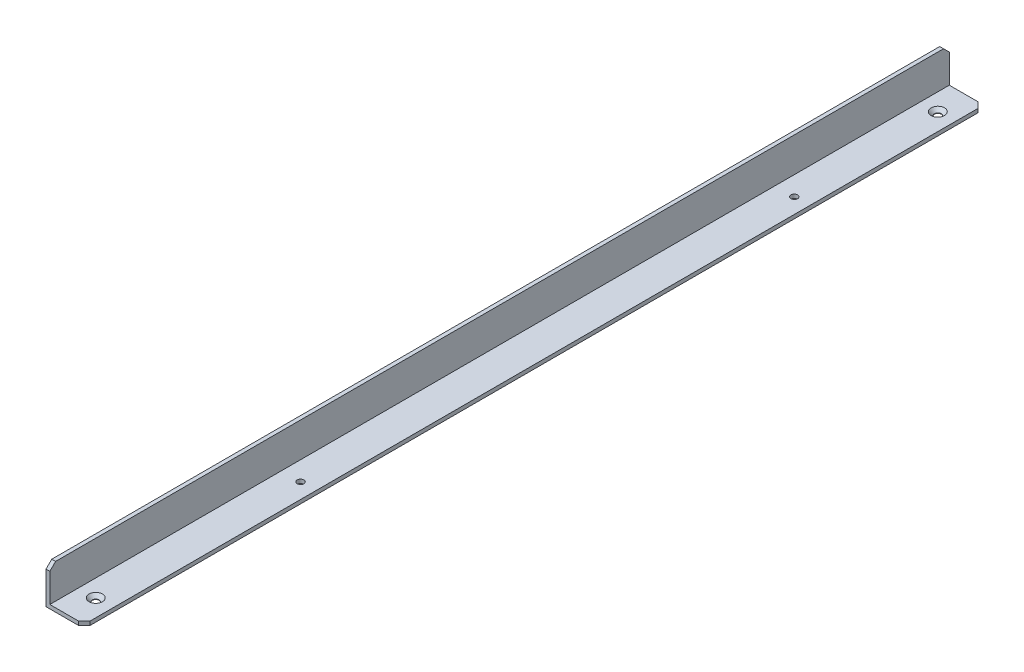
ISO-10303-21;
HEADER;
FILE_DESCRIPTION(('STEP AP214'),'2;1');
FILE_NAME('part.step','',(''),(''),'','','');
FILE_SCHEMA(('AUTOMOTIVE_DESIGN { 1 0 10303 214 1 1 1 1 }'));
ENDSEC;
DATA;
#1=APPLICATION_CONTEXT('core data for automotive mechanical design processes');
#2=APPLICATION_PROTOCOL_DEFINITION('international standard','automotive_design',2000,#1);
#3=PRODUCT_CONTEXT('',#1,'mechanical');
#4=PRODUCT('Part','Part','',(#3));
#5=PRODUCT_RELATED_PRODUCT_CATEGORY('part','',(#4));
#6=PRODUCT_DEFINITION_FORMATION('','',#4);
#7=PRODUCT_DEFINITION_CONTEXT('part definition',#1,'design');
#8=PRODUCT_DEFINITION('design','',#6,#7);
#9=PRODUCT_DEFINITION_SHAPE('','',#8);
#10=(LENGTH_UNIT() NAMED_UNIT(*) SI_UNIT(.MILLI.,.METRE.));
#11=(NAMED_UNIT(*) PLANE_ANGLE_UNIT() SI_UNIT($,.RADIAN.));
#12=(NAMED_UNIT(*) SI_UNIT($,.STERADIAN.) SOLID_ANGLE_UNIT());
#13=UNCERTAINTY_MEASURE_WITH_UNIT(LENGTH_MEASURE(1.E-05),#10,'distance_accuracy_value','');
#14=(GEOMETRIC_REPRESENTATION_CONTEXT(3) GLOBAL_UNCERTAINTY_ASSIGNED_CONTEXT((#13)) GLOBAL_UNIT_ASSIGNED_CONTEXT((#10,
#11,#12)) REPRESENTATION_CONTEXT('',''));
#15=CARTESIAN_POINT('',(0.,0.,0.));
#16=DIRECTION('',(0.,0.,1.));
#17=DIRECTION('',(1.,0.,0.));
#18=AXIS2_PLACEMENT_3D('',#15,#16,#17);
#19=CARTESIAN_POINT('',(0.,0.,235.));
#20=DIRECTION('',(1.,0.,0.));
#21=DIRECTION('',(0.,0.,-1.));
#22=AXIS2_PLACEMENT_3D('',#19,#20,#21);
#23=PLANE('',#22);
#24=DIRECTION('',(0.,0.,-1.));
#25=VECTOR('',#24,1.);
#26=CARTESIAN_POINT('',(0.,20.,235.));
#27=LINE('',#26,#25);
#28=CARTESIAN_POINT('',(0.,20.,232.));
#29=VERTEX_POINT('',#28);
#30=CARTESIAN_POINT('',(0.,19.9999999999999,-232.));
#31=VERTEX_POINT('',#30);
#32=EDGE_CURVE('E193',#29,#31,#27,.T.);
#33=ORIENTED_EDGE('',*,*,#32,.T.);
#34=DIRECTION('',(0.,-0.707106781186547,-0.707106781186547));
#35=VECTOR('',#34,1.);
#36=CARTESIAN_POINT('',(0.,20.,-232.));
#37=LINE('',#36,#35);
#38=CARTESIAN_POINT('',(0.,16.9999999999999,-235.));
#39=VERTEX_POINT('',#38);
#40=EDGE_CURVE('E175',#31,#39,#37,.T.);
#41=ORIENTED_EDGE('',*,*,#40,.T.);
#42=DIRECTION('',(0.,-1.,0.));
#43=VECTOR('',#42,1.);
#44=CARTESIAN_POINT('',(0.,0.,-235.));
#45=LINE('',#44,#43);
#46=CARTESIAN_POINT('',(0.,0.,-235.));
#47=VERTEX_POINT('',#46);
#48=EDGE_CURVE('E135',#39,#47,#45,.T.);
#49=ORIENTED_EDGE('',*,*,#48,.T.);
#50=DIRECTION('',(0.,0.,-1.));
#51=VECTOR('',#50,1.);
#52=CARTESIAN_POINT('',(0.,0.,235.));
#53=LINE('',#52,#51);
#54=CARTESIAN_POINT('',(0.,0.,235.));
#55=VERTEX_POINT('',#54);
#56=EDGE_CURVE('E127',#55,#47,#53,.T.);
#57=ORIENTED_EDGE('',*,*,#56,.F.);
#58=DIRECTION('',(0.,-1.,0.));
#59=VECTOR('',#58,1.);
#60=CARTESIAN_POINT('',(0.,0.,235.));
#61=LINE('',#60,#59);
#62=CARTESIAN_POINT('',(0.,17.,235.));
#63=VERTEX_POINT('',#62);
#64=EDGE_CURVE('E114',#63,#55,#61,.T.);
#65=ORIENTED_EDGE('',*,*,#64,.F.);
#66=DIRECTION('',(0.,-0.707106781186547,0.707106781186547));
#67=VECTOR('',#66,1.);
#68=CARTESIAN_POINT('',(0.,17.,235.));
#69=LINE('',#68,#67);
#70=EDGE_CURVE('E57',#63,#29,#69,.F.);
#71=ORIENTED_EDGE('',*,*,#70,.T.);
#72=EDGE_LOOP('',(#33,#41,#49,#57,#65,#71));
#73=FACE_BOUND('',#72,.T.);
#74=ADVANCED_FACE('F34',(#73),#23,.F.);
#75=CARTESIAN_POINT('',(0.,0.,235.));
#76=DIRECTION('',(0.,1.,0.));
#77=DIRECTION('',(0.,0.,1.));
#78=AXIS2_PLACEMENT_3D('',#75,#76,#77);
#79=PLANE('',#78);
#80=CARTESIAN_POINT('',(12.,0.,114.));
#81=DIRECTION('',(0.,1.,0.));
#82=DIRECTION('',(-1.,0.,0.));
#83=AXIS2_PLACEMENT_3D('',#80,#81,#82);
#84=CIRCLE('',#83,1.75);
#85=CARTESIAN_POINT('',(10.25,0.,114.));
#86=VERTEX_POINT('',#85);
#87=EDGE_CURVE('E236',#86,#86,#84,.T.);
#88=ORIENTED_EDGE('',*,*,#87,.T.);
#89=EDGE_LOOP('',(#88));
#90=FACE_BOUND('',#89,.T.);
#91=CARTESIAN_POINT('',(12.,0.,-144.));
#92=DIRECTION('',(0.,1.,0.));
#93=DIRECTION('',(-1.,0.,0.));
#94=AXIS2_PLACEMENT_3D('',#91,#92,#93);
#95=CIRCLE('',#94,1.75);
#96=CARTESIAN_POINT('',(10.25,0.,-144.));
#97=VERTEX_POINT('',#96);
#98=EDGE_CURVE('E232',#97,#97,#95,.T.);
#99=ORIENTED_EDGE('',*,*,#98,.T.);
#100=EDGE_LOOP('',(#99));
#101=FACE_BOUND('',#100,.T.);
#102=CARTESIAN_POINT('',(11.,0.,-220.));
#103=DIRECTION('',(0.,1.,0.));
#104=DIRECTION('',(-1.,0.,0.));
#105=AXIS2_PLACEMENT_3D('',#102,#103,#104);
#106=CIRCLE('',#105,1.75);
#107=CARTESIAN_POINT('',(9.25000000000001,0.,-220.));
#108=VERTEX_POINT('',#107);
#109=EDGE_CURVE('E154',#108,#108,#106,.T.);
#110=ORIENTED_EDGE('',*,*,#109,.T.);
#111=EDGE_LOOP('',(#110));
#112=FACE_BOUND('',#111,.T.);
#113=CARTESIAN_POINT('',(11.,0.,220.));
#114=DIRECTION('',(0.,1.,0.));
#115=DIRECTION('',(-1.,0.,0.));
#116=AXIS2_PLACEMENT_3D('',#113,#114,#115);
#117=CIRCLE('',#116,1.75);
#118=CARTESIAN_POINT('',(9.25,0.,220.));
#119=VERTEX_POINT('',#118);
#120=EDGE_CURVE('E151',#119,#119,#117,.T.);
#121=ORIENTED_EDGE('',*,*,#120,.T.);
#122=EDGE_LOOP('',(#121));
#123=FACE_BOUND('',#122,.T.);
#124=DIRECTION('',(1.,0.,0.));
#125=VECTOR('',#124,1.);
#126=CARTESIAN_POINT('',(0.,0.,-235.));
#127=LINE('',#126,#125);
#128=CARTESIAN_POINT('',(16.9999999999999,0.,-235.));
#129=VERTEX_POINT('',#128);
#130=EDGE_CURVE('E199',#47,#129,#127,.T.);
#131=ORIENTED_EDGE('',*,*,#130,.T.);
#132=DIRECTION('',(0.707106781186547,0.,0.707106781186547));
#133=VECTOR('',#132,1.);
#134=CARTESIAN_POINT('',(20.,0.,-232.));
#135=LINE('',#134,#133);
#136=CARTESIAN_POINT('',(19.9999999999999,0.,-232.));
#137=VERTEX_POINT('',#136);
#138=EDGE_CURVE('E167',#129,#137,#135,.T.);
#139=ORIENTED_EDGE('',*,*,#138,.T.);
#140=DIRECTION('',(0.,0.,-1.));
#141=VECTOR('',#140,1.);
#142=CARTESIAN_POINT('',(20.,0.,235.));
#143=LINE('',#142,#141);
#144=CARTESIAN_POINT('',(20.,0.,232.));
#145=VERTEX_POINT('',#144);
#146=EDGE_CURVE('E138',#145,#137,#143,.T.);
#147=ORIENTED_EDGE('',*,*,#146,.F.);
#148=DIRECTION('',(0.707106781186547,0.,-0.707106781186547));
#149=VECTOR('',#148,1.);
#150=CARTESIAN_POINT('',(17.,0.,235.));
#151=LINE('',#150,#149);
#152=CARTESIAN_POINT('',(17.,0.,235.));
#153=VERTEX_POINT('',#152);
#154=EDGE_CURVE('E130',#145,#153,#151,.F.);
#155=ORIENTED_EDGE('',*,*,#154,.T.);
#156=DIRECTION('',(1.,0.,0.));
#157=VECTOR('',#156,1.);
#158=CARTESIAN_POINT('',(0.,0.,235.));
#159=LINE('',#158,#157);
#160=EDGE_CURVE('E117',#55,#153,#159,.T.);
#161=ORIENTED_EDGE('',*,*,#160,.F.);
#162=ORIENTED_EDGE('',*,*,#56,.T.);
#163=EDGE_LOOP('',(#131,#139,#147,#155,#161,#162));
#164=FACE_BOUND('',#163,.T.);
#165=ADVANCED_FACE('F126',(#90,#101,#112,#123,#164),#79,.F.);
#166=CARTESIAN_POINT('',(20.,0.,235.));
#167=DIRECTION('',(-1.,0.,0.));
#168=DIRECTION('',(0.,0.,1.));
#169=AXIS2_PLACEMENT_3D('',#166,#167,#168);
#170=PLANE('',#169);
#171=ORIENTED_EDGE('',*,*,#146,.T.);
#172=DIRECTION('',(0.,1.,0.));
#173=VECTOR('',#172,1.);
#174=CARTESIAN_POINT('',(20.,2.,-232.));
#175=LINE('',#174,#173);
#176=CARTESIAN_POINT('',(19.9999999999999,2.,-232.));
#177=VERTEX_POINT('',#176);
#178=EDGE_CURVE('E140',#137,#177,#175,.T.);
#179=ORIENTED_EDGE('',*,*,#178,.T.);
#180=DIRECTION('',(0.,0.,-1.));
#181=VECTOR('',#180,1.);
#182=CARTESIAN_POINT('',(20.,2.,235.));
#183=LINE('',#182,#181);
#184=CARTESIAN_POINT('',(20.,2.,232.));
#185=VERTEX_POINT('',#184);
#186=EDGE_CURVE('E143',#185,#177,#183,.T.);
#187=ORIENTED_EDGE('',*,*,#186,.F.);
#188=DIRECTION('',(0.,-1.,0.));
#189=VECTOR('',#188,1.);
#190=CARTESIAN_POINT('',(20.,0.,232.));
#191=LINE('',#190,#189);
#192=EDGE_CURVE('E137',#185,#145,#191,.T.);
#193=ORIENTED_EDGE('',*,*,#192,.T.);
#194=EDGE_LOOP('',(#171,#179,#187,#193));
#195=FACE_BOUND('',#194,.T.);
#196=ADVANCED_FACE('F220',(#195),#170,.F.);
#197=CARTESIAN_POINT('',(20.,2.,235.));
#198=DIRECTION('',(0.,-1.,0.));
#199=DIRECTION('',(1.,0.,0.));
#200=AXIS2_PLACEMENT_3D('',#197,#198,#199);
#201=PLANE('',#200);
#202=CARTESIAN_POINT('',(12.,2.,114.));
#203=DIRECTION('',(0.,1.,0.));
#204=DIRECTION('',(-1.,0.,0.));
#205=AXIS2_PLACEMENT_3D('',#202,#203,#204);
#206=CIRCLE('',#205,1.75);
#207=CARTESIAN_POINT('',(10.25,2.,114.));
#208=VERTEX_POINT('',#207);
#209=EDGE_CURVE('E239',#208,#208,#206,.T.);
#210=ORIENTED_EDGE('',*,*,#209,.F.);
#211=EDGE_LOOP('',(#210));
#212=FACE_BOUND('',#211,.T.);
#213=CARTESIAN_POINT('',(12.,2.,-144.));
#214=DIRECTION('',(0.,1.,0.));
#215=DIRECTION('',(-1.,0.,0.));
#216=AXIS2_PLACEMENT_3D('',#213,#214,#215);
#217=CIRCLE('',#216,1.75);
#218=CARTESIAN_POINT('',(10.25,2.,-144.));
#219=VERTEX_POINT('',#218);
#220=EDGE_CURVE('E233',#219,#219,#217,.T.);
#221=ORIENTED_EDGE('',*,*,#220,.F.);
#222=EDGE_LOOP('',(#221));
#223=FACE_BOUND('',#222,.T.);
#224=CARTESIAN_POINT('',(11.,2.,220.));
#225=DIRECTION('',(0.,1.,0.));
#226=DIRECTION('',(-1.,0.,0.));
#227=AXIS2_PLACEMENT_3D('',#224,#225,#226);
#228=CIRCLE('',#227,3.5);
#229=CARTESIAN_POINT('',(7.5,2.,220.));
#230=VERTEX_POINT('',#229);
#231=EDGE_CURVE('E150',#230,#230,#228,.T.);
#232=ORIENTED_EDGE('',*,*,#231,.F.);
#233=EDGE_LOOP('',(#232));
#234=FACE_BOUND('',#233,.T.);
#235=CARTESIAN_POINT('',(11.,2.,-220.));
#236=DIRECTION('',(0.,1.,0.));
#237=DIRECTION('',(-1.,0.,0.));
#238=AXIS2_PLACEMENT_3D('',#235,#236,#237);
#239=CIRCLE('',#238,3.5);
#240=CARTESIAN_POINT('',(7.5,2.,-220.));
#241=VERTEX_POINT('',#240);
#242=EDGE_CURVE('E200',#241,#241,#239,.T.);
#243=ORIENTED_EDGE('',*,*,#242,.F.);
#244=EDGE_LOOP('',(#243));
#245=FACE_BOUND('',#244,.T.);
#246=ORIENTED_EDGE('',*,*,#186,.T.);
#247=DIRECTION('',(-0.707106781186547,0.,-0.707106781186547));
#248=VECTOR('',#247,1.);
#249=CARTESIAN_POINT('',(20.,2.,-232.));
#250=LINE('',#249,#248);
#251=CARTESIAN_POINT('',(16.9999999999999,2.,-235.));
#252=VERTEX_POINT('',#251);
#253=EDGE_CURVE('E160',#177,#252,#250,.T.);
#254=ORIENTED_EDGE('',*,*,#253,.T.);
#255=DIRECTION('',(-1.,0.,0.));
#256=VECTOR('',#255,1.);
#257=CARTESIAN_POINT('',(20.,2.,-235.));
#258=LINE('',#257,#256);
#259=CARTESIAN_POINT('',(2.00000000000001,2.,-235.));
#260=VERTEX_POINT('',#259);
#261=EDGE_CURVE('E202',#252,#260,#258,.T.);
#262=ORIENTED_EDGE('',*,*,#261,.T.);
#263=DIRECTION('',(0.,0.,-1.));
#264=VECTOR('',#263,1.);
#265=CARTESIAN_POINT('',(2.00000000000001,2.,235.));
#266=LINE('',#265,#264);
#267=CARTESIAN_POINT('',(2.00000000000001,2.,235.));
#268=VERTEX_POINT('',#267);
#269=EDGE_CURVE('E192',#268,#260,#266,.T.);
#270=ORIENTED_EDGE('',*,*,#269,.F.);
#271=DIRECTION('',(-1.,0.,0.));
#272=VECTOR('',#271,1.);
#273=CARTESIAN_POINT('',(20.,2.,235.));
#274=LINE('',#273,#272);
#275=CARTESIAN_POINT('',(17.,2.,235.));
#276=VERTEX_POINT('',#275);
#277=EDGE_CURVE('E131',#276,#268,#274,.T.);
#278=ORIENTED_EDGE('',*,*,#277,.F.);
#279=DIRECTION('',(-0.707106781186547,0.,0.707106781186547));
#280=VECTOR('',#279,1.);
#281=CARTESIAN_POINT('',(17.,2.,235.));
#282=LINE('',#281,#280);
#283=EDGE_CURVE('E158',#276,#185,#282,.F.);
#284=ORIENTED_EDGE('',*,*,#283,.T.);
#285=EDGE_LOOP('',(#246,#254,#262,#270,#278,#284));
#286=FACE_BOUND('',#285,.T.);
#287=ADVANCED_FACE('F216',(#212,#223,#234,#245,#286),#201,.F.);
#288=CARTESIAN_POINT('',(2.,20.,235.));
#289=DIRECTION('',(-1.,0.,0.));
#290=DIRECTION('',(0.,-1.,0.));
#291=AXIS2_PLACEMENT_3D('',#288,#289,#290);
#292=PLANE('',#291);
#293=DIRECTION('',(0.,1.,0.));
#294=VECTOR('',#293,1.);
#295=CARTESIAN_POINT('',(2.,20.,-235.));
#296=LINE('',#295,#294);
#297=CARTESIAN_POINT('',(2.,16.9999999999999,-235.));
#298=VERTEX_POINT('',#297);
#299=EDGE_CURVE('E121',#260,#298,#296,.T.);
#300=ORIENTED_EDGE('',*,*,#299,.T.);
#301=DIRECTION('',(0.,0.707106781186547,0.707106781186547));
#302=VECTOR('',#301,1.);
#303=CARTESIAN_POINT('',(2.,20.,-232.));
#304=LINE('',#303,#302);
#305=CARTESIAN_POINT('',(2.,19.9999999999999,-232.));
#306=VERTEX_POINT('',#305);
#307=EDGE_CURVE('E178',#298,#306,#304,.T.);
#308=ORIENTED_EDGE('',*,*,#307,.T.);
#309=DIRECTION('',(0.,0.,-1.));
#310=VECTOR('',#309,1.);
#311=CARTESIAN_POINT('',(2.,20.,235.));
#312=LINE('',#311,#310);
#313=CARTESIAN_POINT('',(2.,20.,232.));
#314=VERTEX_POINT('',#313);
#315=EDGE_CURVE('E183',#314,#306,#312,.T.);
#316=ORIENTED_EDGE('',*,*,#315,.F.);
#317=DIRECTION('',(0.,0.707106781186547,-0.707106781186547));
#318=VECTOR('',#317,1.);
#319=CARTESIAN_POINT('',(2.,17.,235.));
#320=LINE('',#319,#318);
#321=CARTESIAN_POINT('',(2.,17.,235.));
#322=VERTEX_POINT('',#321);
#323=EDGE_CURVE('E49',#314,#322,#320,.F.);
#324=ORIENTED_EDGE('',*,*,#323,.T.);
#325=DIRECTION('',(0.,1.,0.));
#326=VECTOR('',#325,1.);
#327=CARTESIAN_POINT('',(2.,20.,235.));
#328=LINE('',#327,#326);
#329=EDGE_CURVE('E207',#268,#322,#328,.T.);
#330=ORIENTED_EDGE('',*,*,#329,.F.);
#331=ORIENTED_EDGE('',*,*,#269,.T.);
#332=EDGE_LOOP('',(#300,#308,#316,#324,#330,#331));
#333=FACE_BOUND('',#332,.T.);
#334=ADVANCED_FACE('F182',(#333),#292,.F.);
#335=CARTESIAN_POINT('',(0.,20.,235.));
#336=DIRECTION('',(0.,-1.,0.));
#337=DIRECTION('',(0.,0.,-1.));
#338=AXIS2_PLACEMENT_3D('',#335,#336,#337);
#339=PLANE('',#338);
#340=ORIENTED_EDGE('',*,*,#315,.T.);
#341=DIRECTION('',(-1.,0.,0.));
#342=VECTOR('',#341,1.);
#343=CARTESIAN_POINT('',(0.,20.,-232.));
#344=LINE('',#343,#342);
#345=EDGE_CURVE('E171',#306,#31,#344,.T.);
#346=ORIENTED_EDGE('',*,*,#345,.T.);
#347=ORIENTED_EDGE('',*,*,#32,.F.);
#348=DIRECTION('',(1.,0.,0.));
#349=VECTOR('',#348,1.);
#350=CARTESIAN_POINT('',(0.,20.,232.));
#351=LINE('',#350,#349);
#352=EDGE_CURVE('E169',#29,#314,#351,.T.);
#353=ORIENTED_EDGE('',*,*,#352,.T.);
#354=EDGE_LOOP('',(#340,#346,#347,#353));
#355=FACE_BOUND('',#354,.T.);
#356=ADVANCED_FACE('F190',(#355),#339,.F.);
#357=CARTESIAN_POINT('',(0.,0.,235.));
#358=DIRECTION('',(0.,0.,-1.));
#359=DIRECTION('',(-1.,0.,0.));
#360=AXIS2_PLACEMENT_3D('',#357,#358,#359);
#361=PLANE('',#360);
#362=ORIENTED_EDGE('',*,*,#160,.T.);
#363=DIRECTION('',(0.,1.,0.));
#364=VECTOR('',#363,1.);
#365=CARTESIAN_POINT('',(17.,0.,235.));
#366=LINE('',#365,#364);
#367=EDGE_CURVE('E11',#153,#276,#366,.T.);
#368=ORIENTED_EDGE('',*,*,#367,.T.);
#369=ORIENTED_EDGE('',*,*,#277,.T.);
#370=ORIENTED_EDGE('',*,*,#329,.T.);
#371=DIRECTION('',(-1.,0.,0.));
#372=VECTOR('',#371,1.);
#373=CARTESIAN_POINT('',(0.,17.,235.));
#374=LINE('',#373,#372);
#375=EDGE_CURVE('E42',#322,#63,#374,.T.);
#376=ORIENTED_EDGE('',*,*,#375,.T.);
#377=ORIENTED_EDGE('',*,*,#64,.T.);
#378=EDGE_LOOP('',(#362,#368,#369,#370,#376,#377));
#379=FACE_BOUND('',#378,.T.);
#380=ADVANCED_FACE('F116',(#379),#361,.F.);
#381=CARTESIAN_POINT('',(0.,0.,-235.));
#382=DIRECTION('',(0.,0.,-1.));
#383=DIRECTION('',(-1.,0.,0.));
#384=AXIS2_PLACEMENT_3D('',#381,#382,#383);
#385=PLANE('',#384);
#386=ORIENTED_EDGE('',*,*,#261,.F.);
#387=DIRECTION('',(0.,-1.,0.));
#388=VECTOR('',#387,1.);
#389=CARTESIAN_POINT('',(16.9999999999999,0.,-235.));
#390=LINE('',#389,#388);
#391=EDGE_CURVE('E164',#252,#129,#390,.T.);
#392=ORIENTED_EDGE('',*,*,#391,.T.);
#393=ORIENTED_EDGE('',*,*,#130,.F.);
#394=ORIENTED_EDGE('',*,*,#48,.F.);
#395=DIRECTION('',(1.,0.,0.));
#396=VECTOR('',#395,1.);
#397=CARTESIAN_POINT('',(2.,16.9999999999999,-235.));
#398=LINE('',#397,#396);
#399=EDGE_CURVE('E162',#39,#298,#398,.T.);
#400=ORIENTED_EDGE('',*,*,#399,.T.);
#401=ORIENTED_EDGE('',*,*,#299,.F.);
#402=EDGE_LOOP('',(#386,#392,#393,#394,#400,#401));
#403=FACE_BOUND('',#402,.T.);
#404=ADVANCED_FACE('F198',(#403),#385,.T.);
#405=CARTESIAN_POINT('',(11.,2.,-220.));
#406=DIRECTION('',(0.,1.,0.));
#407=DIRECTION('',(-1.,0.,0.));
#408=AXIS2_PLACEMENT_3D('',#405,#406,#407);
#409=CONICAL_SURFACE('',#408,3.5,0.78539816339745);
#410=CARTESIAN_POINT('',(11.,0.250000000000002,-220.));
#411=DIRECTION('',(0.,1.,0.));
#412=DIRECTION('',(-1.,0.,0.));
#413=AXIS2_PLACEMENT_3D('',#410,#411,#412);
#414=CIRCLE('',#413,1.75);
#415=CARTESIAN_POINT('',(9.25000000000001,0.250000000000001,-220.));
#416=VERTEX_POINT('',#415);
#417=EDGE_CURVE('E152',#416,#416,#414,.F.);
#418=ORIENTED_EDGE('',*,*,#417,.T.);
#419=EDGE_LOOP('',(#418));
#420=FACE_BOUND('',#419,.T.);
#421=ORIENTED_EDGE('',*,*,#242,.T.);
#422=EDGE_LOOP('',(#421));
#423=FACE_BOUND('',#422,.T.);
#424=ADVANCED_FACE('F263',(#420,#423),#409,.F.);
#425=CARTESIAN_POINT('',(11.,2.,220.));
#426=DIRECTION('',(0.,1.,0.));
#427=DIRECTION('',(-1.,0.,0.));
#428=AXIS2_PLACEMENT_3D('',#425,#426,#427);
#429=CONICAL_SURFACE('',#428,3.5,0.78539816339745);
#430=CARTESIAN_POINT('',(11.,0.250000000000002,220.));
#431=DIRECTION('',(0.,1.,0.));
#432=DIRECTION('',(-1.,0.,0.));
#433=AXIS2_PLACEMENT_3D('',#430,#431,#432);
#434=CIRCLE('',#433,1.75);
#435=CARTESIAN_POINT('',(9.25,0.250000000000001,220.));
#436=VERTEX_POINT('',#435);
#437=EDGE_CURVE('E147',#436,#436,#434,.F.);
#438=ORIENTED_EDGE('',*,*,#437,.T.);
#439=EDGE_LOOP('',(#438));
#440=FACE_BOUND('',#439,.T.);
#441=ORIENTED_EDGE('',*,*,#231,.T.);
#442=EDGE_LOOP('',(#441));
#443=FACE_BOUND('',#442,.T.);
#444=ADVANCED_FACE('F265',(#440,#443),#429,.F.);
#445=CARTESIAN_POINT('',(11.,0.,220.));
#446=DIRECTION('',(0.,1.,0.));
#447=DIRECTION('',(-1.,0.,0.));
#448=AXIS2_PLACEMENT_3D('',#445,#446,#447);
#449=CYLINDRICAL_SURFACE('',#448,1.75);
#450=ORIENTED_EDGE('',*,*,#120,.F.);
#451=EDGE_LOOP('',(#450));
#452=FACE_BOUND('',#451,.T.);
#453=ORIENTED_EDGE('',*,*,#437,.F.);
#454=EDGE_LOOP('',(#453));
#455=FACE_BOUND('',#454,.T.);
#456=ADVANCED_FACE('F272',(#452,#455),#449,.F.);
#457=CARTESIAN_POINT('',(11.,0.,-220.));
#458=DIRECTION('',(0.,1.,0.));
#459=DIRECTION('',(-1.,0.,0.));
#460=AXIS2_PLACEMENT_3D('',#457,#458,#459);
#461=CYLINDRICAL_SURFACE('',#460,1.75);
#462=ORIENTED_EDGE('',*,*,#109,.F.);
#463=EDGE_LOOP('',(#462));
#464=FACE_BOUND('',#463,.T.);
#465=ORIENTED_EDGE('',*,*,#417,.F.);
#466=EDGE_LOOP('',(#465));
#467=FACE_BOUND('',#466,.T.);
#468=ADVANCED_FACE('F288',(#464,#467),#461,.F.);
#469=CARTESIAN_POINT('',(20.,0.,-232.));
#470=DIRECTION('',(0.707106781186547,0.,-0.707106781186547));
#471=DIRECTION('',(0.,-1.,0.));
#472=AXIS2_PLACEMENT_3D('',#469,#470,#471);
#473=PLANE('',#472);
#474=ORIENTED_EDGE('',*,*,#138,.F.);
#475=ORIENTED_EDGE('',*,*,#391,.F.);
#476=ORIENTED_EDGE('',*,*,#253,.F.);
#477=ORIENTED_EDGE('',*,*,#178,.F.);
#478=EDGE_LOOP('',(#474,#475,#476,#477));
#479=FACE_BOUND('',#478,.T.);
#480=ADVANCED_FACE('F285',(#479),#473,.T.);
#481=CARTESIAN_POINT('',(0.,20.,-232.));
#482=DIRECTION('',(0.,0.707106781186547,-0.707106781186547));
#483=DIRECTION('',(1.,0.,0.));
#484=AXIS2_PLACEMENT_3D('',#481,#482,#483);
#485=PLANE('',#484);
#486=ORIENTED_EDGE('',*,*,#307,.F.);
#487=ORIENTED_EDGE('',*,*,#399,.F.);
#488=ORIENTED_EDGE('',*,*,#40,.F.);
#489=ORIENTED_EDGE('',*,*,#345,.F.);
#490=EDGE_LOOP('',(#486,#487,#488,#489));
#491=FACE_BOUND('',#490,.T.);
#492=ADVANCED_FACE('F195',(#491),#485,.T.);
#493=CARTESIAN_POINT('',(17.,0.,235.));
#494=DIRECTION('',(-0.707106781186547,0.,-0.707106781186547));
#495=DIRECTION('',(0.,1.,0.));
#496=AXIS2_PLACEMENT_3D('',#493,#494,#495);
#497=PLANE('',#496);
#498=ORIENTED_EDGE('',*,*,#154,.F.);
#499=ORIENTED_EDGE('',*,*,#192,.F.);
#500=ORIENTED_EDGE('',*,*,#283,.F.);
#501=ORIENTED_EDGE('',*,*,#367,.F.);
#502=EDGE_LOOP('',(#498,#499,#500,#501));
#503=FACE_BOUND('',#502,.T.);
#504=ADVANCED_FACE('F223',(#503),#497,.F.);
#505=CARTESIAN_POINT('',(0.,17.,235.));
#506=DIRECTION('',(0.,-0.707106781186547,-0.707106781186547));
#507=DIRECTION('',(-1.,0.,0.));
#508=AXIS2_PLACEMENT_3D('',#505,#506,#507);
#509=PLANE('',#508);
#510=ORIENTED_EDGE('',*,*,#323,.F.);
#511=ORIENTED_EDGE('',*,*,#352,.F.);
#512=ORIENTED_EDGE('',*,*,#70,.F.);
#513=ORIENTED_EDGE('',*,*,#375,.F.);
#514=EDGE_LOOP('',(#510,#511,#512,#513));
#515=FACE_BOUND('',#514,.T.);
#516=ADVANCED_FACE('F36',(#515),#509,.F.);
#517=CARTESIAN_POINT('',(12.,0.,-144.));
#518=DIRECTION('',(0.,1.,0.));
#519=DIRECTION('',(-1.,0.,0.));
#520=AXIS2_PLACEMENT_3D('',#517,#518,#519);
#521=CYLINDRICAL_SURFACE('',#520,1.75);
#522=ORIENTED_EDGE('',*,*,#98,.F.);
#523=EDGE_LOOP('',(#522));
#524=FACE_BOUND('',#523,.T.);
#525=ORIENTED_EDGE('',*,*,#220,.T.);
#526=EDGE_LOOP('',(#525));
#527=FACE_BOUND('',#526,.T.);
#528=ADVANCED_FACE('F250',(#524,#527),#521,.F.);
#529=CARTESIAN_POINT('',(12.,0.,114.));
#530=DIRECTION('',(0.,1.,0.));
#531=DIRECTION('',(-1.,0.,0.));
#532=AXIS2_PLACEMENT_3D('',#529,#530,#531);
#533=CYLINDRICAL_SURFACE('',#532,1.75);
#534=ORIENTED_EDGE('',*,*,#87,.F.);
#535=EDGE_LOOP('',(#534));
#536=FACE_BOUND('',#535,.T.);
#537=ORIENTED_EDGE('',*,*,#209,.T.);
#538=EDGE_LOOP('',(#537));
#539=FACE_BOUND('',#538,.T.);
#540=ADVANCED_FACE('F247',(#536,#539),#533,.F.);
#541=CLOSED_SHELL('',(#74,#165,#196,#287,#334,#356,#380,#404,#424,#444,#456,#468,#480,#492,#504,
#516,#528,#540));
#542=MANIFOLD_SOLID_BREP('B2',#541);
#543=ADVANCED_BREP_SHAPE_REPRESENTATION('',(#18,#542),#14);
#544=SHAPE_DEFINITION_REPRESENTATION(#9,#543);
ENDSEC;
END-ISO-10303-21;
